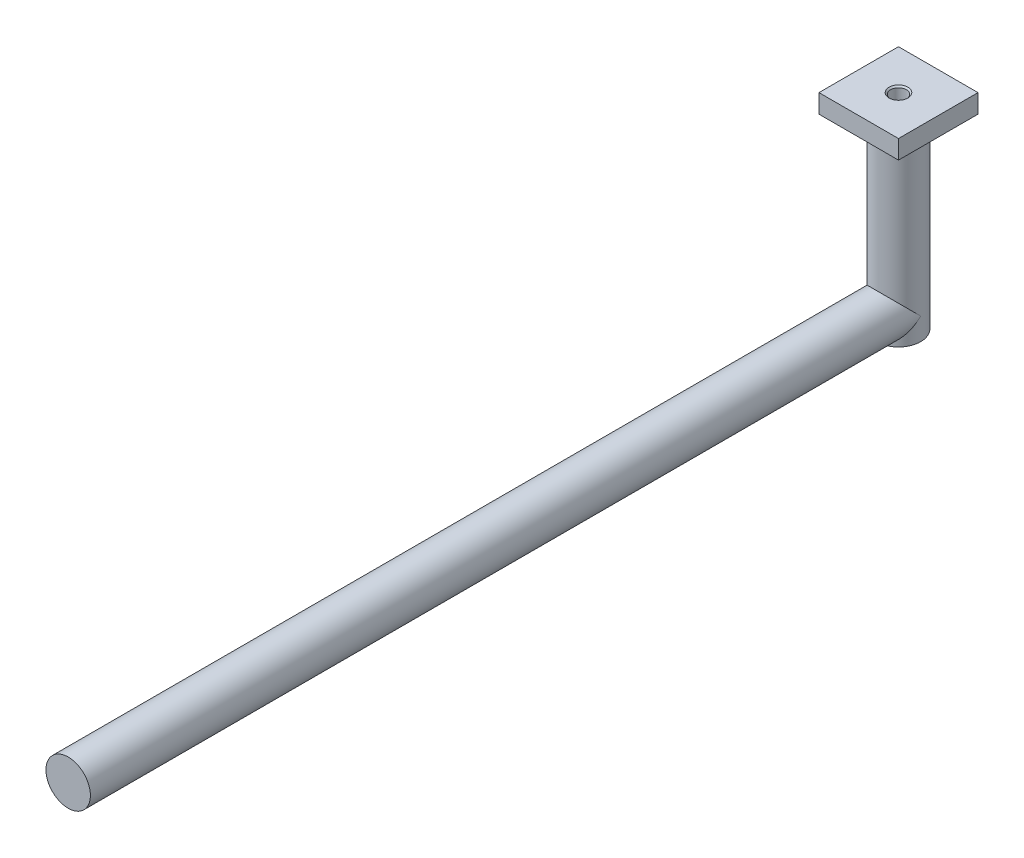
ISO-10303-21;
HEADER;
FILE_DESCRIPTION(('STEP AP214'),'2;1');
FILE_NAME('part.step','',(''),(''),'','','');
FILE_SCHEMA(('AUTOMOTIVE_DESIGN { 1 0 10303 214 1 1 1 1 }'));
ENDSEC;
DATA;
#1=APPLICATION_CONTEXT('core data for automotive mechanical design processes');
#2=APPLICATION_PROTOCOL_DEFINITION('international standard','automotive_design',2000,#1);
#3=PRODUCT_CONTEXT('',#1,'mechanical');
#4=PRODUCT('Part','Part','',(#3));
#5=PRODUCT_RELATED_PRODUCT_CATEGORY('part','',(#4));
#6=PRODUCT_DEFINITION_FORMATION('','',#4);
#7=PRODUCT_DEFINITION_CONTEXT('part definition',#1,'design');
#8=PRODUCT_DEFINITION('design','',#6,#7);
#9=PRODUCT_DEFINITION_SHAPE('','',#8);
#10=(LENGTH_UNIT() NAMED_UNIT(*) SI_UNIT(.MILLI.,.METRE.));
#11=(NAMED_UNIT(*) PLANE_ANGLE_UNIT() SI_UNIT($,.RADIAN.));
#12=(NAMED_UNIT(*) SI_UNIT($,.STERADIAN.) SOLID_ANGLE_UNIT());
#13=UNCERTAINTY_MEASURE_WITH_UNIT(LENGTH_MEASURE(1.E-05),#10,'distance_accuracy_value','');
#14=(GEOMETRIC_REPRESENTATION_CONTEXT(3) GLOBAL_UNCERTAINTY_ASSIGNED_CONTEXT((#13)) GLOBAL_UNIT_ASSIGNED_CONTEXT((#10,
#11,#12)) REPRESENTATION_CONTEXT('',''));
#15=CARTESIAN_POINT('',(0.,0.,0.));
#16=DIRECTION('',(0.,0.,1.));
#17=DIRECTION('',(1.,0.,0.));
#18=AXIS2_PLACEMENT_3D('',#15,#16,#17);
#19=CARTESIAN_POINT('',(0.,0.,355.));
#20=DIRECTION('',(0.,0.,-1.));
#21=DIRECTION('',(-1.,0.,0.));
#22=AXIS2_PLACEMENT_3D('',#19,#20,#21);
#23=CYLINDRICAL_SURFACE('',#22,9.5);
#24=CARTESIAN_POINT('',(0.,0.,355.));
#25=DIRECTION('',(0.,0.,1.));
#26=DIRECTION('',(1.,0.,0.));
#27=AXIS2_PLACEMENT_3D('',#24,#25,#26);
#28=CIRCLE('',#27,9.5);
#29=CARTESIAN_POINT('',(9.5,0.,355.));
#30=VERTEX_POINT('',#29);
#31=EDGE_CURVE('E11',#30,#30,#28,.T.);
#32=ORIENTED_EDGE('',*,*,#31,.F.);
#33=EDGE_LOOP('',(#32));
#34=FACE_BOUND('',#33,.T.);
#35=CARTESIAN_POINT('',(0.,0.,0.));
#36=DIRECTION('',(0.,0.707106781186547,-0.707106781186547));
#37=DIRECTION('',(0.,-0.707106781186547,-0.707106781186547));
#38=AXIS2_PLACEMENT_3D('',#35,#36,#37);
#39=ELLIPSE('',#38,13.4350288425444,9.5);
#40=CARTESIAN_POINT('',(-9.5,0.,0.));
#41=VERTEX_POINT('',#40);
#42=CARTESIAN_POINT('',(9.5,0.,0.));
#43=VERTEX_POINT('',#42);
#44=EDGE_CURVE('E53',#41,#43,#39,.T.);
#45=ORIENTED_EDGE('',*,*,#44,.F.);
#46=CARTESIAN_POINT('',(0.,0.,0.));
#47=DIRECTION('',(0.,-0.707106781186547,-0.707106781186547));
#48=DIRECTION('',(0.,0.707106781186547,-0.707106781186547));
#49=AXIS2_PLACEMENT_3D('',#46,#47,#48);
#50=ELLIPSE('',#49,13.4350288425444,9.5);
#51=CARTESIAN_POINT('',(0.,-9.5,9.5));
#52=VERTEX_POINT('',#51);
#53=EDGE_CURVE('E135',#41,#52,#50,.F.);
#54=ORIENTED_EDGE('',*,*,#53,.T.);
#55=EDGE_CURVE('E63',#52,#43,#50,.F.);
#56=ORIENTED_EDGE('',*,*,#55,.T.);
#57=EDGE_LOOP('',(#45,#54,#56));
#58=FACE_BOUND('',#57,.T.);
#59=ADVANCED_FACE('F46',(#34,#58),#23,.T.);
#60=CARTESIAN_POINT('',(0.,0.,355.));
#61=DIRECTION('',(0.,0.,1.));
#62=DIRECTION('',(1.,0.,0.));
#63=AXIS2_PLACEMENT_3D('',#60,#61,#62);
#64=PLANE('',#63);
#65=ORIENTED_EDGE('',*,*,#31,.T.);
#66=EDGE_LOOP('',(#65));
#67=FACE_BOUND('',#66,.T.);
#68=ADVANCED_FACE('F142',(#67),#64,.T.);
#69=CARTESIAN_POINT('',(0.,70.,0.));
#70=DIRECTION('',(0.,-1.,0.));
#71=DIRECTION('',(0.,0.,-1.));
#72=AXIS2_PLACEMENT_3D('',#69,#70,#71);
#73=CYLINDRICAL_SURFACE('',#72,9.5);
#74=CARTESIAN_POINT('',(0.,70.,0.));
#75=DIRECTION('',(0.,1.,0.));
#76=DIRECTION('',(0.,0.,1.));
#77=AXIS2_PLACEMENT_3D('',#74,#75,#76);
#78=CIRCLE('',#77,9.5);
#79=CARTESIAN_POINT('',(0.,70.,9.5));
#80=VERTEX_POINT('',#79);
#81=EDGE_CURVE('E131',#80,#80,#78,.T.);
#82=ORIENTED_EDGE('',*,*,#81,.F.);
#83=EDGE_LOOP('',(#82));
#84=FACE_BOUND('',#83,.T.);
#85=ORIENTED_EDGE('',*,*,#44,.T.);
#86=ORIENTED_EDGE('',*,*,#55,.F.);
#87=CARTESIAN_POINT('',(0.,-9.5,0.));
#88=DIRECTION('',(0.,1.,0.));
#89=DIRECTION('',(0.,0.,1.));
#90=AXIS2_PLACEMENT_3D('',#87,#88,#89);
#91=CIRCLE('',#90,9.5);
#92=EDGE_CURVE('E121',#52,#52,#91,.T.);
#93=ORIENTED_EDGE('',*,*,#92,.T.);
#94=ORIENTED_EDGE('',*,*,#53,.F.);
#95=EDGE_LOOP('',(#85,#86,#93,#94));
#96=FACE_BOUND('',#95,.T.);
#97=ADVANCED_FACE('F136',(#84,#96),#73,.T.);
#98=CARTESIAN_POINT('',(0.,-9.5,0.));
#99=DIRECTION('',(0.,1.,0.));
#100=DIRECTION('',(0.,0.,1.));
#101=AXIS2_PLACEMENT_3D('',#98,#99,#100);
#102=PLANE('',#101);
#103=CARTESIAN_POINT('',(0.,-9.49999999999999,0.));
#104=DIRECTION('',(0.,1.,0.));
#105=DIRECTION('',(0.,0.,1.));
#106=AXIS2_PLACEMENT_3D('',#103,#104,#105);
#107=CIRCLE('',#106,3.4);
#108=CARTESIAN_POINT('',(0.,-9.49999999999999,3.4));
#109=VERTEX_POINT('',#108);
#110=EDGE_CURVE('E196',#109,#109,#107,.T.);
#111=ORIENTED_EDGE('',*,*,#110,.T.);
#112=EDGE_LOOP('',(#111));
#113=FACE_BOUND('',#112,.T.);
#114=ORIENTED_EDGE('',*,*,#92,.F.);
#115=EDGE_LOOP('',(#114));
#116=FACE_BOUND('',#115,.T.);
#117=ADVANCED_FACE('F155',(#113,#116),#102,.F.);
#118=CARTESIAN_POINT('',(-17.,78.,-17.));
#119=DIRECTION('',(1.,0.,0.));
#120=DIRECTION('',(0.,0.,-1.));
#121=AXIS2_PLACEMENT_3D('',#118,#119,#120);
#122=PLANE('',#121);
#123=DIRECTION('',(0.,0.,1.));
#124=VECTOR('',#123,1.);
#125=CARTESIAN_POINT('',(-17.,70.,-17.));
#126=LINE('',#125,#124);
#127=CARTESIAN_POINT('',(-17.,70.,-17.));
#128=VERTEX_POINT('',#127);
#129=CARTESIAN_POINT('',(-17.,70.,17.));
#130=VERTEX_POINT('',#129);
#131=EDGE_CURVE('E123',#128,#130,#126,.T.);
#132=ORIENTED_EDGE('',*,*,#131,.T.);
#133=DIRECTION('',(0.,-1.,0.));
#134=VECTOR('',#133,1.);
#135=CARTESIAN_POINT('',(-17.,78.,17.));
#136=LINE('',#135,#134);
#137=CARTESIAN_POINT('',(-17.,78.,17.));
#138=VERTEX_POINT('',#137);
#139=EDGE_CURVE('E97',#138,#130,#136,.T.);
#140=ORIENTED_EDGE('',*,*,#139,.F.);
#141=DIRECTION('',(0.,0.,1.));
#142=VECTOR('',#141,1.);
#143=CARTESIAN_POINT('',(-17.,78.,-17.));
#144=LINE('',#143,#142);
#145=CARTESIAN_POINT('',(-17.,78.,-17.));
#146=VERTEX_POINT('',#145);
#147=EDGE_CURVE('E110',#146,#138,#144,.T.);
#148=ORIENTED_EDGE('',*,*,#147,.F.);
#149=DIRECTION('',(0.,-1.,0.));
#150=VECTOR('',#149,1.);
#151=CARTESIAN_POINT('',(-17.,78.,-17.));
#152=LINE('',#151,#150);
#153=EDGE_CURVE('E208',#146,#128,#152,.T.);
#154=ORIENTED_EDGE('',*,*,#153,.T.);
#155=EDGE_LOOP('',(#132,#140,#148,#154));
#156=FACE_BOUND('',#155,.T.);
#157=ADVANCED_FACE('F120',(#156),#122,.F.);
#158=CARTESIAN_POINT('',(-17.,78.,17.));
#159=DIRECTION('',(0.,0.,-1.));
#160=DIRECTION('',(-1.,0.,0.));
#161=AXIS2_PLACEMENT_3D('',#158,#159,#160);
#162=PLANE('',#161);
#163=DIRECTION('',(1.,0.,0.));
#164=VECTOR('',#163,1.);
#165=CARTESIAN_POINT('',(-17.,70.,17.));
#166=LINE('',#165,#164);
#167=CARTESIAN_POINT('',(17.,70.,17.));
#168=VERTEX_POINT('',#167);
#169=EDGE_CURVE('E211',#130,#168,#166,.T.);
#170=ORIENTED_EDGE('',*,*,#169,.T.);
#171=DIRECTION('',(0.,-1.,0.));
#172=VECTOR('',#171,1.);
#173=CARTESIAN_POINT('',(17.,78.,17.));
#174=LINE('',#173,#172);
#175=CARTESIAN_POINT('',(17.,78.,17.));
#176=VERTEX_POINT('',#175);
#177=EDGE_CURVE('E105',#176,#168,#174,.T.);
#178=ORIENTED_EDGE('',*,*,#177,.F.);
#179=DIRECTION('',(1.,0.,0.));
#180=VECTOR('',#179,1.);
#181=CARTESIAN_POINT('',(-17.,78.,17.));
#182=LINE('',#181,#180);
#183=EDGE_CURVE('E92',#138,#176,#182,.T.);
#184=ORIENTED_EDGE('',*,*,#183,.F.);
#185=ORIENTED_EDGE('',*,*,#139,.T.);
#186=EDGE_LOOP('',(#170,#178,#184,#185));
#187=FACE_BOUND('',#186,.T.);
#188=ADVANCED_FACE('F100',(#187),#162,.F.);
#189=CARTESIAN_POINT('',(17.,78.,-17.));
#190=DIRECTION('',(-1.,0.,0.));
#191=DIRECTION('',(0.,0.,1.));
#192=AXIS2_PLACEMENT_3D('',#189,#190,#191);
#193=PLANE('',#192);
#194=DIRECTION('',(0.,0.,-1.));
#195=VECTOR('',#194,1.);
#196=CARTESIAN_POINT('',(17.,70.,-17.));
#197=LINE('',#196,#195);
#198=CARTESIAN_POINT('',(17.,70.,-17.));
#199=VERTEX_POINT('',#198);
#200=EDGE_CURVE('E212',#168,#199,#197,.T.);
#201=ORIENTED_EDGE('',*,*,#200,.T.);
#202=DIRECTION('',(0.,-1.,0.));
#203=VECTOR('',#202,1.);
#204=CARTESIAN_POINT('',(17.,78.,-17.));
#205=LINE('',#204,#203);
#206=CARTESIAN_POINT('',(17.,78.,-17.));
#207=VERTEX_POINT('',#206);
#208=EDGE_CURVE('E126',#207,#199,#205,.T.);
#209=ORIENTED_EDGE('',*,*,#208,.F.);
#210=DIRECTION('',(0.,0.,-1.));
#211=VECTOR('',#210,1.);
#212=CARTESIAN_POINT('',(17.,78.,-17.));
#213=LINE('',#212,#211);
#214=EDGE_CURVE('E106',#176,#207,#213,.T.);
#215=ORIENTED_EDGE('',*,*,#214,.F.);
#216=ORIENTED_EDGE('',*,*,#177,.T.);
#217=EDGE_LOOP('',(#201,#209,#215,#216));
#218=FACE_BOUND('',#217,.T.);
#219=ADVANCED_FACE('F162',(#218),#193,.F.);
#220=CARTESIAN_POINT('',(-17.,78.,-17.));
#221=DIRECTION('',(0.,0.,1.));
#222=DIRECTION('',(1.,0.,0.));
#223=AXIS2_PLACEMENT_3D('',#220,#221,#222);
#224=PLANE('',#223);
#225=DIRECTION('',(-1.,0.,0.));
#226=VECTOR('',#225,1.);
#227=CARTESIAN_POINT('',(-17.,70.,-17.));
#228=LINE('',#227,#226);
#229=EDGE_CURVE('E119',#199,#128,#228,.T.);
#230=ORIENTED_EDGE('',*,*,#229,.T.);
#231=ORIENTED_EDGE('',*,*,#153,.F.);
#232=DIRECTION('',(-1.,0.,0.));
#233=VECTOR('',#232,1.);
#234=CARTESIAN_POINT('',(-17.,78.,-17.));
#235=LINE('',#234,#233);
#236=EDGE_CURVE('E115',#207,#146,#235,.T.);
#237=ORIENTED_EDGE('',*,*,#236,.F.);
#238=ORIENTED_EDGE('',*,*,#208,.T.);
#239=EDGE_LOOP('',(#230,#231,#237,#238));
#240=FACE_BOUND('',#239,.T.);
#241=ADVANCED_FACE('F167',(#240),#224,.F.);
#242=CARTESIAN_POINT('',(0.,78.,0.));
#243=DIRECTION('',(0.,1.,0.));
#244=DIRECTION('',(0.,0.,1.));
#245=AXIS2_PLACEMENT_3D('',#242,#243,#244);
#246=PLANE('',#245);
#247=CARTESIAN_POINT('',(0.,78.,0.));
#248=DIRECTION('',(0.,1.,0.));
#249=DIRECTION('',(0.,0.,1.));
#250=AXIS2_PLACEMENT_3D('',#247,#248,#249);
#251=CIRCLE('',#250,4.025);
#252=CARTESIAN_POINT('',(0.,78.,4.025));
#253=VERTEX_POINT('',#252);
#254=EDGE_CURVE('E191',#253,#253,#251,.T.);
#255=ORIENTED_EDGE('',*,*,#254,.F.);
#256=EDGE_LOOP('',(#255));
#257=FACE_BOUND('',#256,.T.);
#258=ORIENTED_EDGE('',*,*,#147,.T.);
#259=ORIENTED_EDGE('',*,*,#183,.T.);
#260=ORIENTED_EDGE('',*,*,#214,.T.);
#261=ORIENTED_EDGE('',*,*,#236,.T.);
#262=EDGE_LOOP('',(#258,#259,#260,#261));
#263=FACE_BOUND('',#262,.T.);
#264=ADVANCED_FACE('F109',(#257,#263),#246,.T.);
#265=CARTESIAN_POINT('',(0.,70.,0.));
#266=DIRECTION('',(0.,1.,0.));
#267=DIRECTION('',(0.,0.,1.));
#268=AXIS2_PLACEMENT_3D('',#265,#266,#267);
#269=PLANE('',#268);
#270=ORIENTED_EDGE('',*,*,#81,.T.);
#271=EDGE_LOOP('',(#270));
#272=FACE_BOUND('',#271,.T.);
#273=ORIENTED_EDGE('',*,*,#131,.F.);
#274=ORIENTED_EDGE('',*,*,#229,.F.);
#275=ORIENTED_EDGE('',*,*,#200,.F.);
#276=ORIENTED_EDGE('',*,*,#169,.F.);
#277=EDGE_LOOP('',(#273,#274,#275,#276));
#278=FACE_BOUND('',#277,.T.);
#279=ADVANCED_FACE('F173',(#272,#278),#269,.F.);
#280=CARTESIAN_POINT('',(0.,78.,0.));
#281=DIRECTION('',(0.,1.,0.));
#282=DIRECTION('',(0.,0.,1.));
#283=AXIS2_PLACEMENT_3D('',#280,#281,#282);
#284=CYLINDRICAL_SURFACE('',#283,3.4);
#285=ORIENTED_EDGE('',*,*,#110,.F.);
#286=EDGE_LOOP('',(#285));
#287=FACE_BOUND('',#286,.T.);
#288=CARTESIAN_POINT('',(0.,77.375,0.));
#289=DIRECTION('',(0.,1.,0.));
#290=DIRECTION('',(0.,0.,1.));
#291=AXIS2_PLACEMENT_3D('',#288,#289,#290);
#292=CIRCLE('',#291,3.4);
#293=CARTESIAN_POINT('',(0.,77.375,3.4));
#294=VERTEX_POINT('',#293);
#295=EDGE_CURVE('E192',#294,#294,#292,.T.);
#296=ORIENTED_EDGE('',*,*,#295,.T.);
#297=EDGE_LOOP('',(#296));
#298=FACE_BOUND('',#297,.T.);
#299=ADVANCED_FACE('F175',(#287,#298),#284,.F.);
#300=CARTESIAN_POINT('',(0.,78.,0.));
#301=DIRECTION('',(0.,1.,0.));
#302=DIRECTION('',(0.,0.,1.));
#303=AXIS2_PLACEMENT_3D('',#300,#301,#302);
#304=CONICAL_SURFACE('',#303,4.025,0.785398163397449);
#305=ORIENTED_EDGE('',*,*,#295,.F.);
#306=EDGE_LOOP('',(#305));
#307=FACE_BOUND('',#306,.T.);
#308=ORIENTED_EDGE('',*,*,#254,.T.);
#309=EDGE_LOOP('',(#308));
#310=FACE_BOUND('',#309,.T.);
#311=ADVANCED_FACE('F182',(#307,#310),#304,.F.);
#312=CLOSED_SHELL('',(#59,#68,#97,#117,#157,#188,#219,#241,#264,#279,#299,#311));
#313=MANIFOLD_SOLID_BREP('B2',#312);
#314=ADVANCED_BREP_SHAPE_REPRESENTATION('',(#18,#313),#14);
#315=SHAPE_DEFINITION_REPRESENTATION(#9,#314);
ENDSEC;
END-ISO-10303-21;
